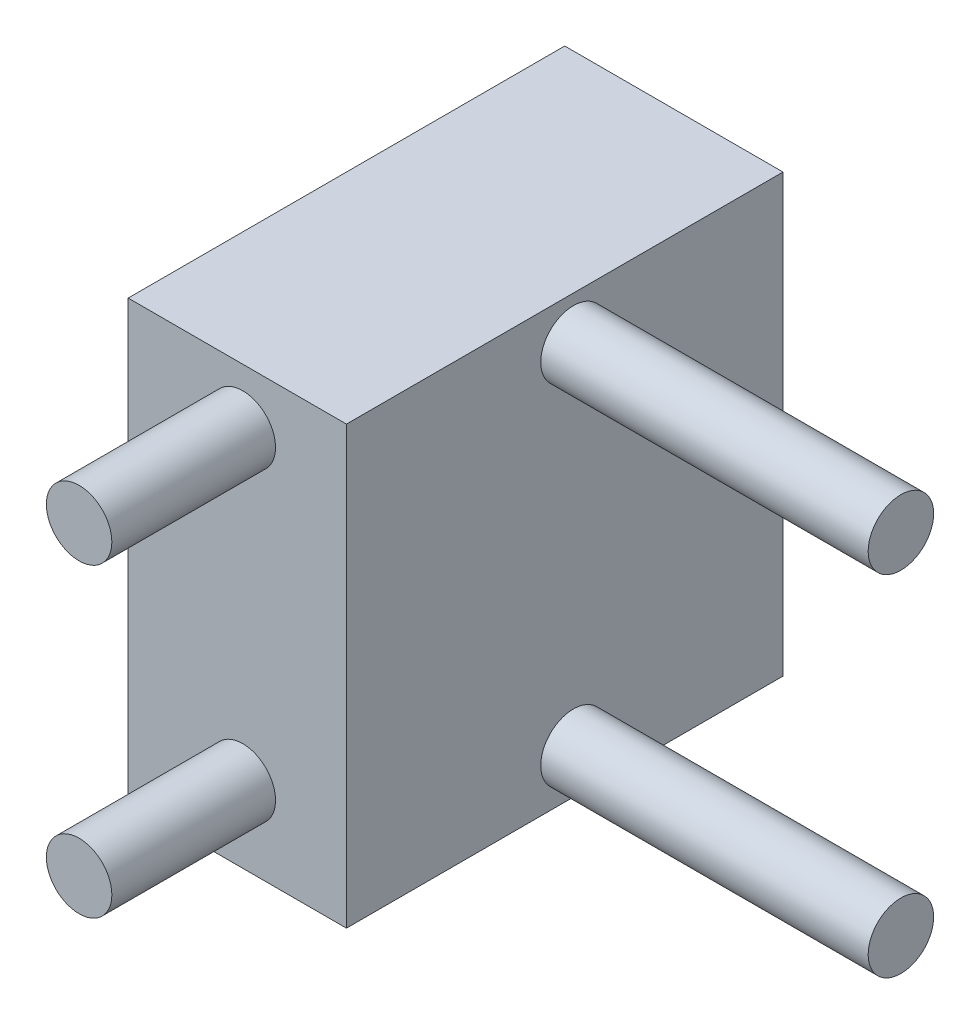
ISO-10303-21;
HEADER;
FILE_DESCRIPTION(('STEP AP214'),'2;1');
FILE_NAME('part.step','',(''),(''),'','','');
FILE_SCHEMA(('AUTOMOTIVE_DESIGN { 1 0 10303 214 1 1 1 1 }'));
ENDSEC;
DATA;
#1=APPLICATION_CONTEXT('core data for automotive mechanical design processes');
#2=APPLICATION_PROTOCOL_DEFINITION('international standard','automotive_design',2000,#1);
#3=PRODUCT_CONTEXT('',#1,'mechanical');
#4=PRODUCT('Part','Part','',(#3));
#5=PRODUCT_RELATED_PRODUCT_CATEGORY('part','',(#4));
#6=PRODUCT_DEFINITION_FORMATION('','',#4);
#7=PRODUCT_DEFINITION_CONTEXT('part definition',#1,'design');
#8=PRODUCT_DEFINITION('design','',#6,#7);
#9=PRODUCT_DEFINITION_SHAPE('','',#8);
#10=(LENGTH_UNIT() NAMED_UNIT(*) SI_UNIT(.MILLI.,.METRE.));
#11=(NAMED_UNIT(*) PLANE_ANGLE_UNIT() SI_UNIT($,.RADIAN.));
#12=(NAMED_UNIT(*) SI_UNIT($,.STERADIAN.) SOLID_ANGLE_UNIT());
#13=UNCERTAINTY_MEASURE_WITH_UNIT(LENGTH_MEASURE(1.E-05),#10,'distance_accuracy_value','');
#14=(GEOMETRIC_REPRESENTATION_CONTEXT(3) GLOBAL_UNCERTAINTY_ASSIGNED_CONTEXT((#13)) GLOBAL_UNIT_ASSIGNED_CONTEXT((#10,
#11,#12)) REPRESENTATION_CONTEXT('',''));
#15=CARTESIAN_POINT('',(0.,0.,0.));
#16=DIRECTION('',(0.,0.,1.));
#17=DIRECTION('',(1.,0.,0.));
#18=AXIS2_PLACEMENT_3D('',#15,#16,#17);
#19=CARTESIAN_POINT('',(10.,20.,0.));
#20=DIRECTION('',(0.,0.,-1.));
#21=DIRECTION('',(-1.,0.,0.));
#22=AXIS2_PLACEMENT_3D('',#19,#20,#21);
#23=PLANE('',#22);
#24=CARTESIAN_POINT('',(5.25202931777326,17.4472377378952,0.));
#25=DIRECTION('',(0.,0.,-1.));
#26=DIRECTION('',(-1.,0.,0.));
#27=AXIS2_PLACEMENT_3D('',#24,#25,#26);
#28=CIRCLE('',#27,1.5);
#29=CARTESIAN_POINT('',(3.75202931777326,17.4472377378952,0.));
#30=VERTEX_POINT('',#29);
#31=EDGE_CURVE('E132',#30,#30,#28,.F.);
#32=ORIENTED_EDGE('',*,*,#31,.F.);
#33=EDGE_LOOP('',(#32));
#34=FACE_BOUND('',#33,.T.);
#35=CARTESIAN_POINT('',(5.25202931777326,3.44723773789524,0.));
#36=DIRECTION('',(0.,0.,-1.));
#37=DIRECTION('',(-1.,0.,0.));
#38=AXIS2_PLACEMENT_3D('',#35,#36,#37);
#39=CIRCLE('',#38,1.5);
#40=CARTESIAN_POINT('',(3.75202931777326,3.44723773789524,0.));
#41=VERTEX_POINT('',#40);
#42=EDGE_CURVE('E128',#41,#41,#39,.F.);
#43=ORIENTED_EDGE('',*,*,#42,.F.);
#44=EDGE_LOOP('',(#43));
#45=FACE_BOUND('',#44,.T.);
#46=DIRECTION('',(1.,0.,0.));
#47=VECTOR('',#46,1.);
#48=CARTESIAN_POINT('',(10.,0.,0.));
#49=LINE('',#48,#47);
#50=CARTESIAN_POINT('',(0.,0.,0.));
#51=VERTEX_POINT('',#50);
#52=CARTESIAN_POINT('',(10.,0.,0.));
#53=VERTEX_POINT('',#52);
#54=EDGE_CURVE('E111',#51,#53,#49,.T.);
#55=ORIENTED_EDGE('',*,*,#54,.T.);
#56=DIRECTION('',(0.,-1.,0.));
#57=VECTOR('',#56,1.);
#58=CARTESIAN_POINT('',(10.,20.,0.));
#59=LINE('',#58,#57);
#60=CARTESIAN_POINT('',(10.,20.,0.));
#61=VERTEX_POINT('',#60);
#62=EDGE_CURVE('E100',#61,#53,#59,.T.);
#63=ORIENTED_EDGE('',*,*,#62,.F.);
#64=DIRECTION('',(1.,0.,0.));
#65=VECTOR('',#64,1.);
#66=CARTESIAN_POINT('',(10.,20.,0.));
#67=LINE('',#66,#65);
#68=CARTESIAN_POINT('',(0.,20.,0.));
#69=VERTEX_POINT('',#68);
#70=EDGE_CURVE('E92',#69,#61,#67,.T.);
#71=ORIENTED_EDGE('',*,*,#70,.F.);
#72=DIRECTION('',(0.,-1.,0.));
#73=VECTOR('',#72,1.);
#74=CARTESIAN_POINT('',(0.,20.,0.));
#75=LINE('',#74,#73);
#76=EDGE_CURVE('E107',#69,#51,#75,.T.);
#77=ORIENTED_EDGE('',*,*,#76,.T.);
#78=EDGE_LOOP('',(#55,#63,#71,#77));
#79=FACE_BOUND('',#78,.T.);
#80=ADVANCED_FACE('F39',(#34,#45,#79),#23,.F.);
#81=CARTESIAN_POINT('',(10.,20.,-20.));
#82=DIRECTION('',(-1.,0.,0.));
#83=DIRECTION('',(0.,0.,1.));
#84=AXIS2_PLACEMENT_3D('',#81,#82,#83);
#85=PLANE('',#84);
#86=CARTESIAN_POINT('',(10.,18.,-10.4006078270784));
#87=DIRECTION('',(-1.,0.,0.));
#88=DIRECTION('',(0.,0.,1.));
#89=AXIS2_PLACEMENT_3D('',#86,#87,#88);
#90=CIRCLE('',#89,1.5);
#91=CARTESIAN_POINT('',(10.,18.,-8.90060782707842));
#92=VERTEX_POINT('',#91);
#93=EDGE_CURVE('E11',#92,#92,#90,.F.);
#94=ORIENTED_EDGE('',*,*,#93,.F.);
#95=EDGE_LOOP('',(#94));
#96=FACE_BOUND('',#95,.T.);
#97=CARTESIAN_POINT('',(10.,2.,-10.4006078270784));
#98=DIRECTION('',(-1.,0.,0.));
#99=DIRECTION('',(0.,0.,1.));
#100=AXIS2_PLACEMENT_3D('',#97,#98,#99);
#101=CIRCLE('',#100,1.5);
#102=CARTESIAN_POINT('',(10.,2.,-8.90060782707842));
#103=VERTEX_POINT('',#102);
#104=EDGE_CURVE('E48',#103,#103,#101,.F.);
#105=ORIENTED_EDGE('',*,*,#104,.F.);
#106=EDGE_LOOP('',(#105));
#107=FACE_BOUND('',#106,.T.);
#108=DIRECTION('',(0.,0.,-1.));
#109=VECTOR('',#108,1.);
#110=CARTESIAN_POINT('',(10.,0.,-20.));
#111=LINE('',#110,#109);
#112=CARTESIAN_POINT('',(10.,0.,-20.));
#113=VERTEX_POINT('',#112);
#114=EDGE_CURVE('E98',#53,#113,#111,.T.);
#115=ORIENTED_EDGE('',*,*,#114,.T.);
#116=DIRECTION('',(0.,-1.,0.));
#117=VECTOR('',#116,1.);
#118=CARTESIAN_POINT('',(10.,20.,-20.));
#119=LINE('',#118,#117);
#120=CARTESIAN_POINT('',(10.,20.,-20.));
#121=VERTEX_POINT('',#120);
#122=EDGE_CURVE('E96',#121,#113,#119,.T.);
#123=ORIENTED_EDGE('',*,*,#122,.F.);
#124=DIRECTION('',(0.,0.,-1.));
#125=VECTOR('',#124,1.);
#126=CARTESIAN_POINT('',(10.,20.,-20.));
#127=LINE('',#126,#125);
#128=EDGE_CURVE('E87',#61,#121,#127,.T.);
#129=ORIENTED_EDGE('',*,*,#128,.F.);
#130=ORIENTED_EDGE('',*,*,#62,.T.);
#131=EDGE_LOOP('',(#115,#123,#129,#130));
#132=FACE_BOUND('',#131,.T.);
#133=ADVANCED_FACE('F97',(#96,#107,#132),#85,.F.);
#134=CARTESIAN_POINT('',(0.,20.,-20.));
#135=DIRECTION('',(0.,0.,1.));
#136=DIRECTION('',(1.,0.,0.));
#137=AXIS2_PLACEMENT_3D('',#134,#135,#136);
#138=PLANE('',#137);
#139=DIRECTION('',(-1.,0.,0.));
#140=VECTOR('',#139,1.);
#141=CARTESIAN_POINT('',(0.,0.,-20.));
#142=LINE('',#141,#140);
#143=CARTESIAN_POINT('',(0.,0.,-20.));
#144=VERTEX_POINT('',#143);
#145=EDGE_CURVE('E73',#113,#144,#142,.T.);
#146=ORIENTED_EDGE('',*,*,#145,.T.);
#147=DIRECTION('',(0.,-1.,0.));
#148=VECTOR('',#147,1.);
#149=CARTESIAN_POINT('',(0.,20.,-20.));
#150=LINE('',#149,#148);
#151=CARTESIAN_POINT('',(0.,20.,-20.));
#152=VERTEX_POINT('',#151);
#153=EDGE_CURVE('E101',#152,#144,#150,.T.);
#154=ORIENTED_EDGE('',*,*,#153,.F.);
#155=DIRECTION('',(-1.,0.,0.));
#156=VECTOR('',#155,1.);
#157=CARTESIAN_POINT('',(0.,20.,-20.));
#158=LINE('',#157,#156);
#159=EDGE_CURVE('E90',#121,#152,#158,.T.);
#160=ORIENTED_EDGE('',*,*,#159,.F.);
#161=ORIENTED_EDGE('',*,*,#122,.T.);
#162=EDGE_LOOP('',(#146,#154,#160,#161));
#163=FACE_BOUND('',#162,.T.);
#164=ADVANCED_FACE('F103',(#163),#138,.F.);
#165=CARTESIAN_POINT('',(0.,20.,0.));
#166=DIRECTION('',(1.,0.,0.));
#167=DIRECTION('',(0.,0.,-1.));
#168=AXIS2_PLACEMENT_3D('',#165,#166,#167);
#169=PLANE('',#168);
#170=DIRECTION('',(0.,0.,1.));
#171=VECTOR('',#170,1.);
#172=CARTESIAN_POINT('',(0.,0.,0.));
#173=LINE('',#172,#171);
#174=EDGE_CURVE('E79',#144,#51,#173,.T.);
#175=ORIENTED_EDGE('',*,*,#174,.T.);
#176=ORIENTED_EDGE('',*,*,#76,.F.);
#177=DIRECTION('',(0.,0.,1.));
#178=VECTOR('',#177,1.);
#179=CARTESIAN_POINT('',(0.,20.,0.));
#180=LINE('',#179,#178);
#181=EDGE_CURVE('E56',#152,#69,#180,.T.);
#182=ORIENTED_EDGE('',*,*,#181,.F.);
#183=ORIENTED_EDGE('',*,*,#153,.T.);
#184=EDGE_LOOP('',(#175,#176,#182,#183));
#185=FACE_BOUND('',#184,.T.);
#186=ADVANCED_FACE('F148',(#185),#169,.F.);
#187=CARTESIAN_POINT('',(0.,20.,0.));
#188=DIRECTION('',(0.,-1.,0.));
#189=DIRECTION('',(0.,0.,-1.));
#190=AXIS2_PLACEMENT_3D('',#187,#188,#189);
#191=PLANE('',#190);
#192=ORIENTED_EDGE('',*,*,#70,.T.);
#193=ORIENTED_EDGE('',*,*,#128,.T.);
#194=ORIENTED_EDGE('',*,*,#159,.T.);
#195=ORIENTED_EDGE('',*,*,#181,.T.);
#196=EDGE_LOOP('',(#192,#193,#194,#195));
#197=FACE_BOUND('',#196,.T.);
#198=ADVANCED_FACE('F88',(#197),#191,.F.);
#199=CARTESIAN_POINT('',(0.,0.,0.));
#200=DIRECTION('',(0.,-1.,0.));
#201=DIRECTION('',(0.,0.,-1.));
#202=AXIS2_PLACEMENT_3D('',#199,#200,#201);
#203=PLANE('',#202);
#204=ORIENTED_EDGE('',*,*,#54,.F.);
#205=ORIENTED_EDGE('',*,*,#174,.F.);
#206=ORIENTED_EDGE('',*,*,#145,.F.);
#207=ORIENTED_EDGE('',*,*,#114,.F.);
#208=EDGE_LOOP('',(#204,#205,#206,#207));
#209=FACE_BOUND('',#208,.T.);
#210=ADVANCED_FACE('F156',(#209),#203,.T.);
#211=CARTESIAN_POINT('',(5.25202931777326,3.44723773789524,7.5));
#212=DIRECTION('',(0.,0.,-1.));
#213=DIRECTION('',(-1.,0.,0.));
#214=AXIS2_PLACEMENT_3D('',#211,#212,#213);
#215=CYLINDRICAL_SURFACE('',#214,1.5);
#216=CARTESIAN_POINT('',(5.25202931777326,3.44723773789524,7.5));
#217=DIRECTION('',(0.,0.,1.));
#218=DIRECTION('',(1.,0.,0.));
#219=AXIS2_PLACEMENT_3D('',#216,#217,#218);
#220=CIRCLE('',#219,1.5);
#221=CARTESIAN_POINT('',(6.75202931777326,3.44723773789524,7.5));
#222=VERTEX_POINT('',#221);
#223=EDGE_CURVE('E115',#222,#222,#220,.T.);
#224=ORIENTED_EDGE('',*,*,#223,.F.);
#225=EDGE_LOOP('',(#224));
#226=FACE_BOUND('',#225,.T.);
#227=ORIENTED_EDGE('',*,*,#42,.T.);
#228=EDGE_LOOP('',(#227));
#229=FACE_BOUND('',#228,.T.);
#230=ADVANCED_FACE('F159',(#226,#229),#215,.T.);
#231=CARTESIAN_POINT('',(5.25202931777326,3.44723773789524,7.5));
#232=DIRECTION('',(0.,0.,1.));
#233=DIRECTION('',(1.,0.,0.));
#234=AXIS2_PLACEMENT_3D('',#231,#232,#233);
#235=PLANE('',#234);
#236=ORIENTED_EDGE('',*,*,#223,.T.);
#237=EDGE_LOOP('',(#236));
#238=FACE_BOUND('',#237,.T.);
#239=ADVANCED_FACE('F165',(#238),#235,.T.);
#240=CARTESIAN_POINT('',(5.25202931777326,17.4472377378952,7.5));
#241=DIRECTION('',(0.,0.,-1.));
#242=DIRECTION('',(-1.,0.,0.));
#243=AXIS2_PLACEMENT_3D('',#240,#241,#242);
#244=CYLINDRICAL_SURFACE('',#243,1.5);
#245=CARTESIAN_POINT('',(5.25202931777326,17.4472377378952,7.5));
#246=DIRECTION('',(0.,0.,1.));
#247=DIRECTION('',(1.,0.,0.));
#248=AXIS2_PLACEMENT_3D('',#245,#246,#247);
#249=CIRCLE('',#248,1.5);
#250=CARTESIAN_POINT('',(6.75202931777326,17.4472377378952,7.5));
#251=VERTEX_POINT('',#250);
#252=EDGE_CURVE('E202',#251,#251,#249,.T.);
#253=ORIENTED_EDGE('',*,*,#252,.F.);
#254=EDGE_LOOP('',(#253));
#255=FACE_BOUND('',#254,.T.);
#256=ORIENTED_EDGE('',*,*,#31,.T.);
#257=EDGE_LOOP('',(#256));
#258=FACE_BOUND('',#257,.T.);
#259=ADVANCED_FACE('F169',(#255,#258),#244,.T.);
#260=CARTESIAN_POINT('',(5.25202931777326,17.4472377378952,7.5));
#261=DIRECTION('',(0.,0.,1.));
#262=DIRECTION('',(1.,0.,0.));
#263=AXIS2_PLACEMENT_3D('',#260,#261,#262);
#264=PLANE('',#263);
#265=ORIENTED_EDGE('',*,*,#252,.T.);
#266=EDGE_LOOP('',(#265));
#267=FACE_BOUND('',#266,.T.);
#268=ADVANCED_FACE('F173',(#267),#264,.T.);
#269=CARTESIAN_POINT('',(25.,2.,-10.4006078270784));
#270=DIRECTION('',(-1.,0.,0.));
#271=DIRECTION('',(0.,0.,1.));
#272=AXIS2_PLACEMENT_3D('',#269,#270,#271);
#273=CYLINDRICAL_SURFACE('',#272,1.5);
#274=CARTESIAN_POINT('',(25.,2.,-10.4006078270784));
#275=DIRECTION('',(1.,0.,0.));
#276=DIRECTION('',(0.,0.,-1.));
#277=AXIS2_PLACEMENT_3D('',#274,#275,#276);
#278=CIRCLE('',#277,1.5);
#279=CARTESIAN_POINT('',(25.,2.,-11.9006078270784));
#280=VERTEX_POINT('',#279);
#281=EDGE_CURVE('E198',#280,#280,#278,.T.);
#282=ORIENTED_EDGE('',*,*,#281,.F.);
#283=EDGE_LOOP('',(#282));
#284=FACE_BOUND('',#283,.T.);
#285=ORIENTED_EDGE('',*,*,#104,.T.);
#286=EDGE_LOOP('',(#285));
#287=FACE_BOUND('',#286,.T.);
#288=ADVANCED_FACE('F139',(#284,#287),#273,.T.);
#289=CARTESIAN_POINT('',(25.,2.,-10.4006078270784));
#290=DIRECTION('',(1.,0.,0.));
#291=DIRECTION('',(0.,0.,-1.));
#292=AXIS2_PLACEMENT_3D('',#289,#290,#291);
#293=PLANE('',#292);
#294=ORIENTED_EDGE('',*,*,#281,.T.);
#295=EDGE_LOOP('',(#294));
#296=FACE_BOUND('',#295,.T.);
#297=ADVANCED_FACE('F180',(#296),#293,.T.);
#298=CARTESIAN_POINT('',(25.,18.,-10.4006078270784));
#299=DIRECTION('',(-1.,0.,0.));
#300=DIRECTION('',(0.,0.,1.));
#301=AXIS2_PLACEMENT_3D('',#298,#299,#300);
#302=CYLINDRICAL_SURFACE('',#301,1.5);
#303=CARTESIAN_POINT('',(25.,18.,-10.4006078270784));
#304=DIRECTION('',(1.,0.,0.));
#305=DIRECTION('',(0.,0.,-1.));
#306=AXIS2_PLACEMENT_3D('',#303,#304,#305);
#307=CIRCLE('',#306,1.5);
#308=CARTESIAN_POINT('',(25.,18.,-11.9006078270784));
#309=VERTEX_POINT('',#308);
#310=EDGE_CURVE('E196',#309,#309,#307,.T.);
#311=ORIENTED_EDGE('',*,*,#310,.F.);
#312=EDGE_LOOP('',(#311));
#313=FACE_BOUND('',#312,.T.);
#314=ORIENTED_EDGE('',*,*,#93,.T.);
#315=EDGE_LOOP('',(#314));
#316=FACE_BOUND('',#315,.T.);
#317=ADVANCED_FACE('F184',(#313,#316),#302,.T.);
#318=CARTESIAN_POINT('',(25.,18.,-10.4006078270784));
#319=DIRECTION('',(1.,0.,0.));
#320=DIRECTION('',(0.,0.,-1.));
#321=AXIS2_PLACEMENT_3D('',#318,#319,#320);
#322=PLANE('',#321);
#323=ORIENTED_EDGE('',*,*,#310,.T.);
#324=EDGE_LOOP('',(#323));
#325=FACE_BOUND('',#324,.T.);
#326=ADVANCED_FACE('F188',(#325),#322,.T.);
#327=CLOSED_SHELL('',(#80,#133,#164,#186,#198,#210,#230,#239,#259,#268,#288,#297,#317,#326));
#328=MANIFOLD_SOLID_BREP('B2',#327);
#329=ADVANCED_BREP_SHAPE_REPRESENTATION('',(#18,#328),#14);
#330=SHAPE_DEFINITION_REPRESENTATION(#9,#329);
ENDSEC;
END-ISO-10303-21;
